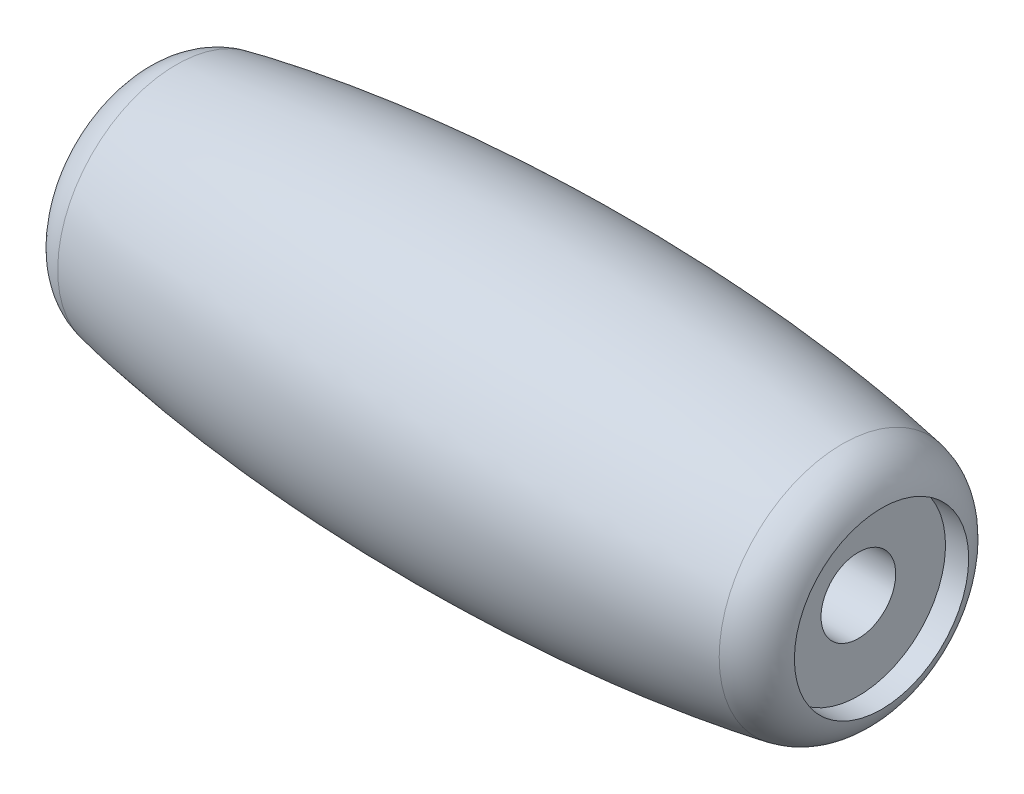
ISO-10303-21;
HEADER;
FILE_DESCRIPTION(('STEP AP214'),'2;1');
FILE_NAME('part.step','',(''),(''),'','','');
FILE_SCHEMA(('AUTOMOTIVE_DESIGN { 1 0 10303 214 1 1 1 1 }'));
ENDSEC;
DATA;
#1=APPLICATION_CONTEXT('core data for automotive mechanical design processes');
#2=APPLICATION_PROTOCOL_DEFINITION('international standard','automotive_design',2000,#1);
#3=PRODUCT_CONTEXT('',#1,'mechanical');
#4=PRODUCT('Part','Part','',(#3));
#5=PRODUCT_RELATED_PRODUCT_CATEGORY('part','',(#4));
#6=PRODUCT_DEFINITION_FORMATION('','',#4);
#7=PRODUCT_DEFINITION_CONTEXT('part definition',#1,'design');
#8=PRODUCT_DEFINITION('design','',#6,#7);
#9=PRODUCT_DEFINITION_SHAPE('','',#8);
#10=(LENGTH_UNIT() NAMED_UNIT(*) SI_UNIT(.MILLI.,.METRE.));
#11=(NAMED_UNIT(*) PLANE_ANGLE_UNIT() SI_UNIT($,.RADIAN.));
#12=(NAMED_UNIT(*) SI_UNIT($,.STERADIAN.) SOLID_ANGLE_UNIT());
#13=UNCERTAINTY_MEASURE_WITH_UNIT(LENGTH_MEASURE(1.E-05),#10,'distance_accuracy_value','');
#14=(GEOMETRIC_REPRESENTATION_CONTEXT(3) GLOBAL_UNCERTAINTY_ASSIGNED_CONTEXT((#13)) GLOBAL_UNIT_ASSIGNED_CONTEXT((#10,
#11,#12)) REPRESENTATION_CONTEXT('',''));
#15=CARTESIAN_POINT('',(0.,0.,0.));
#16=DIRECTION('',(0.,0.,1.));
#17=DIRECTION('',(1.,0.,0.));
#18=AXIS2_PLACEMENT_3D('',#15,#16,#17);
#19=CARTESIAN_POINT('',(-15.4738700674317,0.,0.));
#20=DIRECTION('',(1.,0.,0.));
#21=DIRECTION('',(0.,1.,0.));
#22=AXIS2_PLACEMENT_3D('',#19,#20,#21);
#23=CYLINDRICAL_SURFACE('',#22,1.5);
#24=CARTESIAN_POINT('',(13.5261299325683,0.,0.));
#25=DIRECTION('',(1.,0.,0.));
#26=DIRECTION('',(0.,1.,0.));
#27=AXIS2_PLACEMENT_3D('',#24,#25,#26);
#28=CIRCLE('',#27,1.5);
#29=CARTESIAN_POINT('',(13.5261299325683,1.5,0.));
#30=VERTEX_POINT('',#29);
#31=EDGE_CURVE('E53',#30,#30,#28,.T.);
#32=ORIENTED_EDGE('',*,*,#31,.T.);
#33=EDGE_LOOP('',(#32));
#34=FACE_BOUND('',#33,.T.);
#35=CARTESIAN_POINT('',(-14.4738700674317,0.,0.));
#36=DIRECTION('',(1.,0.,0.));
#37=DIRECTION('',(0.,1.,0.));
#38=AXIS2_PLACEMENT_3D('',#35,#36,#37);
#39=CIRCLE('',#38,1.5);
#40=CARTESIAN_POINT('',(-14.4738700674317,1.5,0.));
#41=VERTEX_POINT('',#40);
#42=EDGE_CURVE('E95',#41,#41,#39,.T.);
#43=ORIENTED_EDGE('',*,*,#42,.F.);
#44=EDGE_LOOP('',(#43));
#45=FACE_BOUND('',#44,.T.);
#46=ADVANCED_FACE('F32',(#34,#45),#23,.F.);
#47=CARTESIAN_POINT('',(-13.4738700674317,0.,0.));
#48=DIRECTION('',(-1.,0.,0.));
#49=DIRECTION('',(0.,-1.,0.));
#50=AXIS2_PLACEMENT_3D('',#47,#48,#49);
#51=TOROIDAL_SURFACE('',#50,2.79631353554721,1.99999999999999);
#52=CARTESIAN_POINT('',(-13.8712648360543,0.,0.));
#53=DIRECTION('',(-1.,0.,0.));
#54=DIRECTION('',(0.,-1.,0.));
#55=AXIS2_PLACEMENT_3D('',#52,#53,#54);
#56=CIRCLE('',#55,4.75643531693514);
#57=CARTESIAN_POINT('',(-13.8712648360543,-4.75643531693514,0.));
#58=VERTEX_POINT('',#57);
#59=EDGE_CURVE('E40',#58,#58,#56,.T.);
#60=ORIENTED_EDGE('',*,*,#59,.T.);
#61=EDGE_LOOP('',(#60));
#62=FACE_BOUND('',#61,.T.);
#63=CARTESIAN_POINT('',(-15.3459879482677,0.,0.));
#64=DIRECTION('',(1.,0.,0.));
#65=DIRECTION('',(0.,1.,0.));
#66=AXIS2_PLACEMENT_3D('',#63,#64,#65);
#67=CIRCLE('',#66,3.5);
#68=CARTESIAN_POINT('',(-15.3459879482677,3.5,0.));
#69=VERTEX_POINT('',#68);
#70=EDGE_CURVE('E36',#69,#69,#67,.F.);
#71=ORIENTED_EDGE('',*,*,#70,.F.);
#72=EDGE_LOOP('',(#71));
#73=FACE_BOUND('',#72,.T.);
#74=ADVANCED_FACE('F66',(#62,#73),#51,.T.);
#75=CARTESIAN_POINT('',(12.5261299325683,0.,0.));
#76=DIRECTION('',(-1.,0.,0.));
#77=DIRECTION('',(0.,-1.,0.));
#78=AXIS2_PLACEMENT_3D('',#75,#76,#77);
#79=TOROIDAL_SURFACE('',#78,2.97798218095922,2.);
#80=CARTESIAN_POINT('',(14.4568027159793,0.,0.));
#81=DIRECTION('',(-1.,0.,0.));
#82=DIRECTION('',(0.,-1.,0.));
#83=AXIS2_PLACEMENT_3D('',#80,#81,#82);
#84=CIRCLE('',#83,3.5);
#85=CARTESIAN_POINT('',(14.4568027159793,-3.5,0.));
#86=VERTEX_POINT('',#85);
#87=EDGE_CURVE('E45',#86,#86,#84,.T.);
#88=ORIENTED_EDGE('',*,*,#87,.T.);
#89=EDGE_LOOP('',(#88));
#90=FACE_BOUND('',#89,.T.);
#91=CARTESIAN_POINT('',(12.8824795736655,0.,0.));
#92=DIRECTION('',(-1.,0.,0.));
#93=DIRECTION('',(0.,-1.,0.));
#94=AXIS2_PLACEMENT_3D('',#91,#92,#93);
#95=CIRCLE('',#94,4.94597987742379);
#96=CARTESIAN_POINT('',(12.8824795736655,-4.94597987742379,0.));
#97=VERTEX_POINT('',#96);
#98=EDGE_CURVE('E10',#97,#97,#95,.T.);
#99=ORIENTED_EDGE('',*,*,#98,.F.);
#100=EDGE_LOOP('',(#99));
#101=FACE_BOUND('',#100,.T.);
#102=ADVANCED_FACE('F34',(#90,#101),#79,.T.);
#103=CARTESIAN_POINT('',(0.,0.,0.));
#104=DIRECTION('',(0.,0.,1.));
#105=DIRECTION('',(1.,0.,0.));
#106=AXIS2_PLACEMENT_3D('',#103,#104,#105);
#107=ELLIPSE('',#106,22.7561579272588,6.);
#108=TRIMMED_CURVE('',#107,(PARAMETER_VALUE(0.)),(PARAMETER_VALUE(3.14159265358979)),.T.,.PARAMETER.);
#109=CARTESIAN_POINT('',(-15.4738700674317,0.,0.));
#110=DIRECTION('',(-1.,0.,0.));
#111=AXIS1_PLACEMENT('',#109,#110);
#112=SURFACE_OF_REVOLUTION('',#108,#111);
#113=ORIENTED_EDGE('',*,*,#59,.F.);
#114=EDGE_LOOP('',(#113));
#115=FACE_BOUND('',#114,.T.);
#116=ORIENTED_EDGE('',*,*,#98,.T.);
#117=EDGE_LOOP('',(#116));
#118=FACE_BOUND('',#117,.T.);
#119=ADVANCED_FACE('F61',(#115,#118),#112,.T.);
#120=CARTESIAN_POINT('',(13.5261299325683,0.,0.));
#121=DIRECTION('',(1.,0.,0.));
#122=DIRECTION('',(0.,1.,0.));
#123=AXIS2_PLACEMENT_3D('',#120,#121,#122);
#124=CYLINDRICAL_SURFACE('',#123,3.5);
#125=CARTESIAN_POINT('',(13.5261299325683,0.,0.));
#126=DIRECTION('',(1.,0.,0.));
#127=DIRECTION('',(0.,1.,0.));
#128=AXIS2_PLACEMENT_3D('',#125,#126,#127);
#129=CIRCLE('',#128,3.5);
#130=CARTESIAN_POINT('',(13.5261299325683,3.5,0.));
#131=VERTEX_POINT('',#130);
#132=EDGE_CURVE('E49',#131,#131,#129,.T.);
#133=ORIENTED_EDGE('',*,*,#132,.F.);
#134=EDGE_LOOP('',(#133));
#135=FACE_BOUND('',#134,.T.);
#136=ORIENTED_EDGE('',*,*,#87,.F.);
#137=EDGE_LOOP('',(#136));
#138=FACE_BOUND('',#137,.T.);
#139=ADVANCED_FACE('F64',(#135,#138),#124,.F.);
#140=CARTESIAN_POINT('',(13.5261299325683,0.,0.));
#141=DIRECTION('',(1.,0.,0.));
#142=DIRECTION('',(0.,1.,0.));
#143=AXIS2_PLACEMENT_3D('',#140,#141,#142);
#144=PLANE('',#143);
#145=ORIENTED_EDGE('',*,*,#31,.F.);
#146=EDGE_LOOP('',(#145));
#147=FACE_BOUND('',#146,.T.);
#148=ORIENTED_EDGE('',*,*,#132,.T.);
#149=EDGE_LOOP('',(#148));
#150=FACE_BOUND('',#149,.T.);
#151=ADVANCED_FACE('F75',(#147,#150),#144,.T.);
#152=CARTESIAN_POINT('',(-14.4738700674317,0.,0.));
#153=DIRECTION('',(-1.,0.,0.));
#154=DIRECTION('',(0.,-1.,0.));
#155=AXIS2_PLACEMENT_3D('',#152,#153,#154);
#156=CYLINDRICAL_SURFACE('',#155,3.5);
#157=CARTESIAN_POINT('',(-14.4738700674317,0.,0.));
#158=DIRECTION('',(1.,0.,0.));
#159=DIRECTION('',(0.,1.,0.));
#160=AXIS2_PLACEMENT_3D('',#157,#158,#159);
#161=CIRCLE('',#160,3.5);
#162=CARTESIAN_POINT('',(-14.4738700674317,3.5,0.));
#163=VERTEX_POINT('',#162);
#164=EDGE_CURVE('E92',#163,#163,#161,.T.);
#165=ORIENTED_EDGE('',*,*,#164,.T.);
#166=EDGE_LOOP('',(#165));
#167=FACE_BOUND('',#166,.T.);
#168=ORIENTED_EDGE('',*,*,#70,.T.);
#169=EDGE_LOOP('',(#168));
#170=FACE_BOUND('',#169,.T.);
#171=ADVANCED_FACE('F79',(#167,#170),#156,.F.);
#172=CARTESIAN_POINT('',(-14.4738700674317,0.,0.));
#173=DIRECTION('',(-1.,0.,0.));
#174=DIRECTION('',(0.,1.,0.));
#175=AXIS2_PLACEMENT_3D('',#172,#173,#174);
#176=PLANE('',#175);
#177=ORIENTED_EDGE('',*,*,#164,.F.);
#178=EDGE_LOOP('',(#177));
#179=FACE_BOUND('',#178,.T.);
#180=ORIENTED_EDGE('',*,*,#42,.T.);
#181=EDGE_LOOP('',(#180));
#182=FACE_BOUND('',#181,.T.);
#183=ADVANCED_FACE('F83',(#179,#182),#176,.T.);
#184=CLOSED_SHELL('',(#46,#74,#102,#119,#139,#151,#171,#183));
#185=MANIFOLD_SOLID_BREP('B2',#184);
#186=ADVANCED_BREP_SHAPE_REPRESENTATION('',(#18,#185),#14);
#187=SHAPE_DEFINITION_REPRESENTATION(#9,#186);
ENDSEC;
END-ISO-10303-21;
